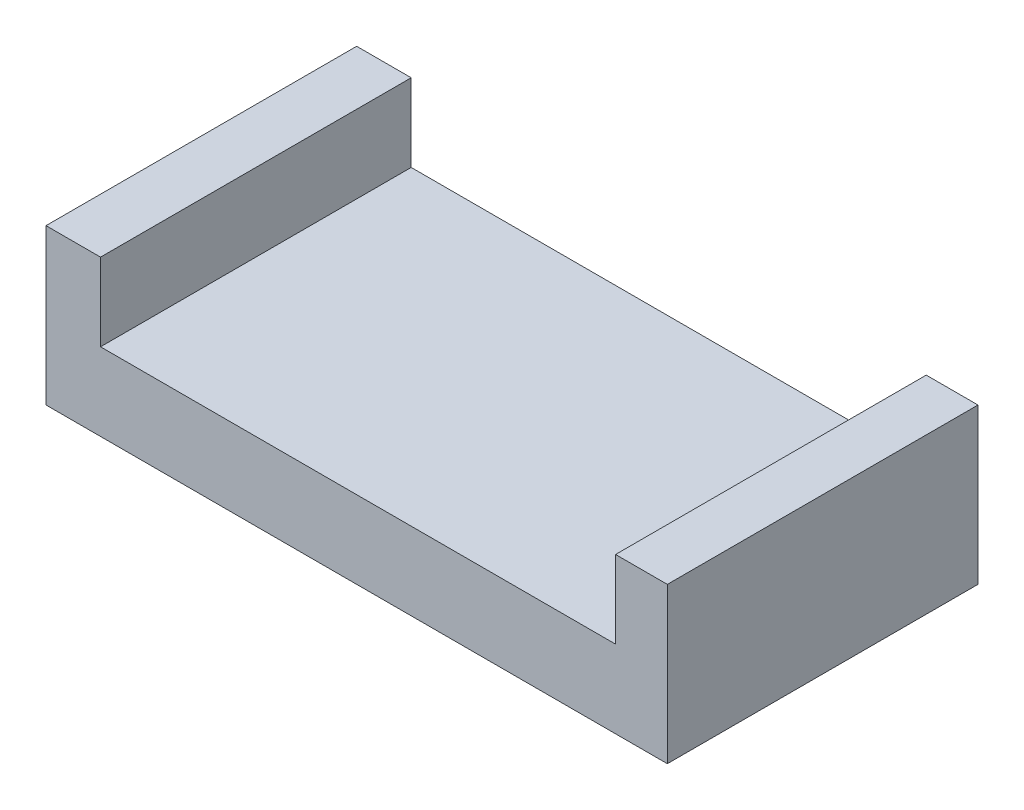
ISO-10303-21;
HEADER;
FILE_DESCRIPTION(('STEP AP214'),'2;1');
FILE_NAME('part.step','',(''),(''),'','','');
FILE_SCHEMA(('AUTOMOTIVE_DESIGN { 1 0 10303 214 1 1 1 1 }'));
ENDSEC;
DATA;
#1=APPLICATION_CONTEXT('core data for automotive mechanical design processes');
#2=APPLICATION_PROTOCOL_DEFINITION('international standard','automotive_design',2000,#1);
#3=PRODUCT_CONTEXT('',#1,'mechanical');
#4=PRODUCT('Part','Part','',(#3));
#5=PRODUCT_RELATED_PRODUCT_CATEGORY('part','',(#4));
#6=PRODUCT_DEFINITION_FORMATION('','',#4);
#7=PRODUCT_DEFINITION_CONTEXT('part definition',#1,'design');
#8=PRODUCT_DEFINITION('design','',#6,#7);
#9=PRODUCT_DEFINITION_SHAPE('','',#8);
#10=(LENGTH_UNIT() NAMED_UNIT(*) SI_UNIT(.MILLI.,.METRE.));
#11=(NAMED_UNIT(*) PLANE_ANGLE_UNIT() SI_UNIT($,.RADIAN.));
#12=(NAMED_UNIT(*) SI_UNIT($,.STERADIAN.) SOLID_ANGLE_UNIT());
#13=UNCERTAINTY_MEASURE_WITH_UNIT(LENGTH_MEASURE(1.E-05),#10,'distance_accuracy_value','');
#14=(GEOMETRIC_REPRESENTATION_CONTEXT(3) GLOBAL_UNCERTAINTY_ASSIGNED_CONTEXT((#13)) GLOBAL_UNIT_ASSIGNED_CONTEXT((#10,
#11,#12)) REPRESENTATION_CONTEXT('',''));
#15=CARTESIAN_POINT('',(0.,0.,0.));
#16=DIRECTION('',(0.,0.,1.));
#17=DIRECTION('',(1.,0.,0.));
#18=AXIS2_PLACEMENT_3D('',#15,#16,#17);
#19=CARTESIAN_POINT('',(0.,1.905,0.));
#20=DIRECTION('',(0.,1.,0.));
#21=DIRECTION('',(0.,0.,1.));
#22=AXIS2_PLACEMENT_3D('',#19,#20,#21);
#23=PLANE('',#22);
#24=DIRECTION('',(1.,0.,0.));
#25=VECTOR('',#24,1.);
#26=CARTESIAN_POINT('',(7.62,1.905,3.81));
#27=LINE('',#26,#25);
#28=CARTESIAN_POINT('',(-6.28241860079014,1.905,3.81));
#29=VERTEX_POINT('',#28);
#30=CARTESIAN_POINT('',(6.35,1.905,3.81));
#31=VERTEX_POINT('',#30);
#32=EDGE_CURVE('E52',#29,#31,#27,.T.);
#33=ORIENTED_EDGE('',*,*,#32,.T.);
#34=DIRECTION('',(0.,0.,1.));
#35=VECTOR('',#34,1.);
#36=CARTESIAN_POINT('',(6.35,1.905,-3.81));
#37=LINE('',#36,#35);
#38=CARTESIAN_POINT('',(6.35,1.905,-3.81));
#39=VERTEX_POINT('',#38);
#40=EDGE_CURVE('E47',#39,#31,#37,.T.);
#41=ORIENTED_EDGE('',*,*,#40,.F.);
#42=DIRECTION('',(-1.,0.,0.));
#43=VECTOR('',#42,1.);
#44=CARTESIAN_POINT('',(7.62,1.905,-3.81));
#45=LINE('',#44,#43);
#46=CARTESIAN_POINT('',(-6.28241860079015,1.905,-3.81));
#47=VERTEX_POINT('',#46);
#48=EDGE_CURVE('E150',#39,#47,#45,.T.);
#49=ORIENTED_EDGE('',*,*,#48,.T.);
#50=DIRECTION('',(0.,0.,-1.));
#51=VECTOR('',#50,1.);
#52=CARTESIAN_POINT('',(-6.28241860079015,1.905,3.81));
#53=LINE('',#52,#51);
#54=EDGE_CURVE('E129',#29,#47,#53,.T.);
#55=ORIENTED_EDGE('',*,*,#54,.F.);
#56=EDGE_LOOP('',(#33,#41,#49,#55));
#57=FACE_BOUND('',#56,.T.);
#58=ADVANCED_FACE('F32',(#57),#23,.T.);
#59=CARTESIAN_POINT('',(-7.62,1.905,3.81));
#60=DIRECTION('',(1.,0.,0.));
#61=DIRECTION('',(0.,0.,-1.));
#62=AXIS2_PLACEMENT_3D('',#59,#60,#61);
#63=PLANE('',#62);
#64=DIRECTION('',(0.,0.,1.));
#65=VECTOR('',#64,1.);
#66=CARTESIAN_POINT('',(-7.62,0.,3.81));
#67=LINE('',#66,#65);
#68=CARTESIAN_POINT('',(-7.62,0.,-3.81));
#69=VERTEX_POINT('',#68);
#70=CARTESIAN_POINT('',(-7.62,0.,3.81));
#71=VERTEX_POINT('',#70);
#72=EDGE_CURVE('E148',#69,#71,#67,.T.);
#73=ORIENTED_EDGE('',*,*,#72,.T.);
#74=DIRECTION('',(0.,-1.,0.));
#75=VECTOR('',#74,1.);
#76=CARTESIAN_POINT('',(-7.62,1.905,3.81));
#77=LINE('',#76,#75);
#78=CARTESIAN_POINT('',(-7.62,3.81,3.81));
#79=VERTEX_POINT('',#78);
#80=EDGE_CURVE('E11',#79,#71,#77,.T.);
#81=ORIENTED_EDGE('',*,*,#80,.F.);
#82=DIRECTION('',(0.,0.,1.));
#83=VECTOR('',#82,1.);
#84=CARTESIAN_POINT('',(-7.62,3.81,3.81));
#85=LINE('',#84,#83);
#86=CARTESIAN_POINT('',(-7.62,3.81,-3.81));
#87=VERTEX_POINT('',#86);
#88=EDGE_CURVE('E130',#87,#79,#85,.T.);
#89=ORIENTED_EDGE('',*,*,#88,.F.);
#90=DIRECTION('',(0.,-1.,0.));
#91=VECTOR('',#90,1.);
#92=CARTESIAN_POINT('',(-7.62,1.905,-3.81));
#93=LINE('',#92,#91);
#94=EDGE_CURVE('E105',#87,#69,#93,.T.);
#95=ORIENTED_EDGE('',*,*,#94,.T.);
#96=EDGE_LOOP('',(#73,#81,#89,#95));
#97=FACE_BOUND('',#96,.T.);
#98=ADVANCED_FACE('F34',(#97),#63,.F.);
#99=CARTESIAN_POINT('',(7.62,1.905,3.81));
#100=DIRECTION('',(0.,0.,-1.));
#101=DIRECTION('',(-1.,0.,0.));
#102=AXIS2_PLACEMENT_3D('',#99,#100,#101);
#103=PLANE('',#102);
#104=DIRECTION('',(1.,0.,0.));
#105=VECTOR('',#104,1.);
#106=CARTESIAN_POINT('',(7.62,0.,3.81));
#107=LINE('',#106,#105);
#108=CARTESIAN_POINT('',(7.62,0.,3.81));
#109=VERTEX_POINT('',#108);
#110=EDGE_CURVE('E155',#71,#109,#107,.T.);
#111=ORIENTED_EDGE('',*,*,#110,.T.);
#112=DIRECTION('',(0.,-1.,0.));
#113=VECTOR('',#112,1.);
#114=CARTESIAN_POINT('',(7.62,1.905,3.81));
#115=LINE('',#114,#113);
#116=CARTESIAN_POINT('',(7.62,3.81,3.81));
#117=VERTEX_POINT('',#116);
#118=EDGE_CURVE('E40',#117,#109,#115,.T.);
#119=ORIENTED_EDGE('',*,*,#118,.F.);
#120=DIRECTION('',(1.,0.,0.));
#121=VECTOR('',#120,1.);
#122=CARTESIAN_POINT('',(7.62,3.81,3.81));
#123=LINE('',#122,#121);
#124=CARTESIAN_POINT('',(6.35,3.81,3.81));
#125=VERTEX_POINT('',#124);
#126=EDGE_CURVE('E119',#125,#117,#123,.T.);
#127=ORIENTED_EDGE('',*,*,#126,.F.);
#128=DIRECTION('',(0.,-1.,0.));
#129=VECTOR('',#128,1.);
#130=CARTESIAN_POINT('',(6.35,3.81,3.81));
#131=LINE('',#130,#129);
#132=EDGE_CURVE('E124',#125,#31,#131,.T.);
#133=ORIENTED_EDGE('',*,*,#132,.T.);
#134=ORIENTED_EDGE('',*,*,#32,.F.);
#135=DIRECTION('',(0.,-1.,0.));
#136=VECTOR('',#135,1.);
#137=CARTESIAN_POINT('',(-6.28241860079015,3.81,3.81));
#138=LINE('',#137,#136);
#139=CARTESIAN_POINT('',(-6.28241860079015,3.81,3.81));
#140=VERTEX_POINT('',#139);
#141=EDGE_CURVE('E145',#140,#29,#138,.T.);
#142=ORIENTED_EDGE('',*,*,#141,.F.);
#143=DIRECTION('',(1.,0.,0.));
#144=VECTOR('',#143,1.);
#145=CARTESIAN_POINT('',(-7.62,3.81,3.81));
#146=LINE('',#145,#144);
#147=EDGE_CURVE('E133',#79,#140,#146,.T.);
#148=ORIENTED_EDGE('',*,*,#147,.F.);
#149=ORIENTED_EDGE('',*,*,#80,.T.);
#150=EDGE_LOOP('',(#111,#119,#127,#133,#134,#142,#148,#149));
#151=FACE_BOUND('',#150,.T.);
#152=ADVANCED_FACE('F175',(#151),#103,.F.);
#153=CARTESIAN_POINT('',(7.62,1.905,3.81));
#154=DIRECTION('',(-1.,0.,0.));
#155=DIRECTION('',(0.,0.,1.));
#156=AXIS2_PLACEMENT_3D('',#153,#154,#155);
#157=PLANE('',#156);
#158=DIRECTION('',(0.,0.,-1.));
#159=VECTOR('',#158,1.);
#160=CARTESIAN_POINT('',(7.62,0.,3.81));
#161=LINE('',#160,#159);
#162=CARTESIAN_POINT('',(7.62,0.,-3.81));
#163=VERTEX_POINT('',#162);
#164=EDGE_CURVE('E102',#109,#163,#161,.T.);
#165=ORIENTED_EDGE('',*,*,#164,.T.);
#166=DIRECTION('',(0.,-1.,0.));
#167=VECTOR('',#166,1.);
#168=CARTESIAN_POINT('',(7.62,1.905,-3.81));
#169=LINE('',#168,#167);
#170=CARTESIAN_POINT('',(7.62,3.81,-3.81));
#171=VERTEX_POINT('',#170);
#172=EDGE_CURVE('E95',#171,#163,#169,.T.);
#173=ORIENTED_EDGE('',*,*,#172,.F.);
#174=DIRECTION('',(0.,0.,-1.));
#175=VECTOR('',#174,1.);
#176=CARTESIAN_POINT('',(7.62,3.81,-3.81));
#177=LINE('',#176,#175);
#178=EDGE_CURVE('E100',#117,#171,#177,.T.);
#179=ORIENTED_EDGE('',*,*,#178,.F.);
#180=ORIENTED_EDGE('',*,*,#118,.T.);
#181=EDGE_LOOP('',(#165,#173,#179,#180));
#182=FACE_BOUND('',#181,.T.);
#183=ADVANCED_FACE('F97',(#182),#157,.F.);
#184=CARTESIAN_POINT('',(7.62,1.905,-3.81));
#185=DIRECTION('',(0.,0.,1.));
#186=DIRECTION('',(1.,0.,0.));
#187=AXIS2_PLACEMENT_3D('',#184,#185,#186);
#188=PLANE('',#187);
#189=DIRECTION('',(-1.,0.,0.));
#190=VECTOR('',#189,1.);
#191=CARTESIAN_POINT('',(7.62,0.,-3.81));
#192=LINE('',#191,#190);
#193=EDGE_CURVE('E151',#163,#69,#192,.T.);
#194=ORIENTED_EDGE('',*,*,#193,.T.);
#195=ORIENTED_EDGE('',*,*,#94,.F.);
#196=DIRECTION('',(-1.,0.,0.));
#197=VECTOR('',#196,1.);
#198=CARTESIAN_POINT('',(-7.62,3.81,-3.81));
#199=LINE('',#198,#197);
#200=CARTESIAN_POINT('',(-6.28241860079015,3.81,-3.81));
#201=VERTEX_POINT('',#200);
#202=EDGE_CURVE('E137',#201,#87,#199,.T.);
#203=ORIENTED_EDGE('',*,*,#202,.F.);
#204=DIRECTION('',(0.,-1.,0.));
#205=VECTOR('',#204,1.);
#206=CARTESIAN_POINT('',(-6.28241860079015,3.81,-3.81));
#207=LINE('',#206,#205);
#208=EDGE_CURVE('E140',#201,#47,#207,.T.);
#209=ORIENTED_EDGE('',*,*,#208,.T.);
#210=ORIENTED_EDGE('',*,*,#48,.F.);
#211=DIRECTION('',(0.,-1.,0.));
#212=VECTOR('',#211,1.);
#213=CARTESIAN_POINT('',(6.35,3.81,-3.81));
#214=LINE('',#213,#212);
#215=CARTESIAN_POINT('',(6.35,3.81,-3.81));
#216=VERTEX_POINT('',#215);
#217=EDGE_CURVE('E111',#216,#39,#214,.T.);
#218=ORIENTED_EDGE('',*,*,#217,.F.);
#219=DIRECTION('',(-1.,0.,0.));
#220=VECTOR('',#219,1.);
#221=CARTESIAN_POINT('',(7.62,3.81,-3.81));
#222=LINE('',#221,#220);
#223=EDGE_CURVE('E108',#171,#216,#222,.T.);
#224=ORIENTED_EDGE('',*,*,#223,.F.);
#225=ORIENTED_EDGE('',*,*,#172,.T.);
#226=EDGE_LOOP('',(#194,#195,#203,#209,#210,#218,#224,#225));
#227=FACE_BOUND('',#226,.T.);
#228=ADVANCED_FACE('F109',(#227),#188,.F.);
#229=CARTESIAN_POINT('',(0.,0.,0.));
#230=DIRECTION('',(0.,1.,0.));
#231=DIRECTION('',(0.,0.,1.));
#232=AXIS2_PLACEMENT_3D('',#229,#230,#231);
#233=PLANE('',#232);
#234=ORIENTED_EDGE('',*,*,#72,.F.);
#235=ORIENTED_EDGE('',*,*,#193,.F.);
#236=ORIENTED_EDGE('',*,*,#164,.F.);
#237=ORIENTED_EDGE('',*,*,#110,.F.);
#238=EDGE_LOOP('',(#234,#235,#236,#237));
#239=FACE_BOUND('',#238,.T.);
#240=ADVANCED_FACE('F163',(#239),#233,.F.);
#241=CARTESIAN_POINT('',(-6.28241860079015,3.81,3.81));
#242=DIRECTION('',(-1.,0.,0.));
#243=DIRECTION('',(0.,0.,1.));
#244=AXIS2_PLACEMENT_3D('',#241,#242,#243);
#245=PLANE('',#244);
#246=ORIENTED_EDGE('',*,*,#54,.T.);
#247=ORIENTED_EDGE('',*,*,#208,.F.);
#248=DIRECTION('',(0.,0.,-1.));
#249=VECTOR('',#248,1.);
#250=CARTESIAN_POINT('',(-6.28241860079015,3.81,3.81));
#251=LINE('',#250,#249);
#252=EDGE_CURVE('E135',#140,#201,#251,.T.);
#253=ORIENTED_EDGE('',*,*,#252,.F.);
#254=ORIENTED_EDGE('',*,*,#141,.T.);
#255=EDGE_LOOP('',(#246,#247,#253,#254));
#256=FACE_BOUND('',#255,.T.);
#257=ADVANCED_FACE('F174',(#256),#245,.F.);
#258=CARTESIAN_POINT('',(0.,3.81,0.));
#259=DIRECTION('',(0.,-1.,0.));
#260=DIRECTION('',(0.,0.,-1.));
#261=AXIS2_PLACEMENT_3D('',#258,#259,#260);
#262=PLANE('',#261);
#263=ORIENTED_EDGE('',*,*,#88,.T.);
#264=ORIENTED_EDGE('',*,*,#147,.T.);
#265=ORIENTED_EDGE('',*,*,#252,.T.);
#266=ORIENTED_EDGE('',*,*,#202,.T.);
#267=EDGE_LOOP('',(#263,#264,#265,#266));
#268=FACE_BOUND('',#267,.T.);
#269=ADVANCED_FACE('F169',(#268),#262,.F.);
#270=CARTESIAN_POINT('',(6.35,3.81,-3.81));
#271=DIRECTION('',(1.,0.,0.));
#272=DIRECTION('',(0.,0.,-1.));
#273=AXIS2_PLACEMENT_3D('',#270,#271,#272);
#274=PLANE('',#273);
#275=ORIENTED_EDGE('',*,*,#40,.T.);
#276=ORIENTED_EDGE('',*,*,#132,.F.);
#277=DIRECTION('',(0.,0.,1.));
#278=VECTOR('',#277,1.);
#279=CARTESIAN_POINT('',(6.35,3.81,-3.81));
#280=LINE('',#279,#278);
#281=EDGE_CURVE('E114',#216,#125,#280,.T.);
#282=ORIENTED_EDGE('',*,*,#281,.F.);
#283=ORIENTED_EDGE('',*,*,#217,.T.);
#284=EDGE_LOOP('',(#275,#276,#282,#283));
#285=FACE_BOUND('',#284,.T.);
#286=ADVANCED_FACE('F178',(#285),#274,.F.);
#287=CARTESIAN_POINT('',(0.,3.81,0.));
#288=DIRECTION('',(0.,-1.,0.));
#289=DIRECTION('',(0.,0.,-1.));
#290=AXIS2_PLACEMENT_3D('',#287,#288,#289);
#291=PLANE('',#290);
#292=ORIENTED_EDGE('',*,*,#178,.T.);
#293=ORIENTED_EDGE('',*,*,#223,.T.);
#294=ORIENTED_EDGE('',*,*,#281,.T.);
#295=ORIENTED_EDGE('',*,*,#126,.T.);
#296=EDGE_LOOP('',(#292,#293,#294,#295));
#297=FACE_BOUND('',#296,.T.);
#298=ADVANCED_FACE('F117',(#297),#291,.F.);
#299=CLOSED_SHELL('',(#58,#98,#152,#183,#228,#240,#257,#269,#286,#298));
#300=MANIFOLD_SOLID_BREP('B2',#299);
#301=ADVANCED_BREP_SHAPE_REPRESENTATION('',(#18,#300),#14);
#302=SHAPE_DEFINITION_REPRESENTATION(#9,#301);
ENDSEC;
END-ISO-10303-21;
